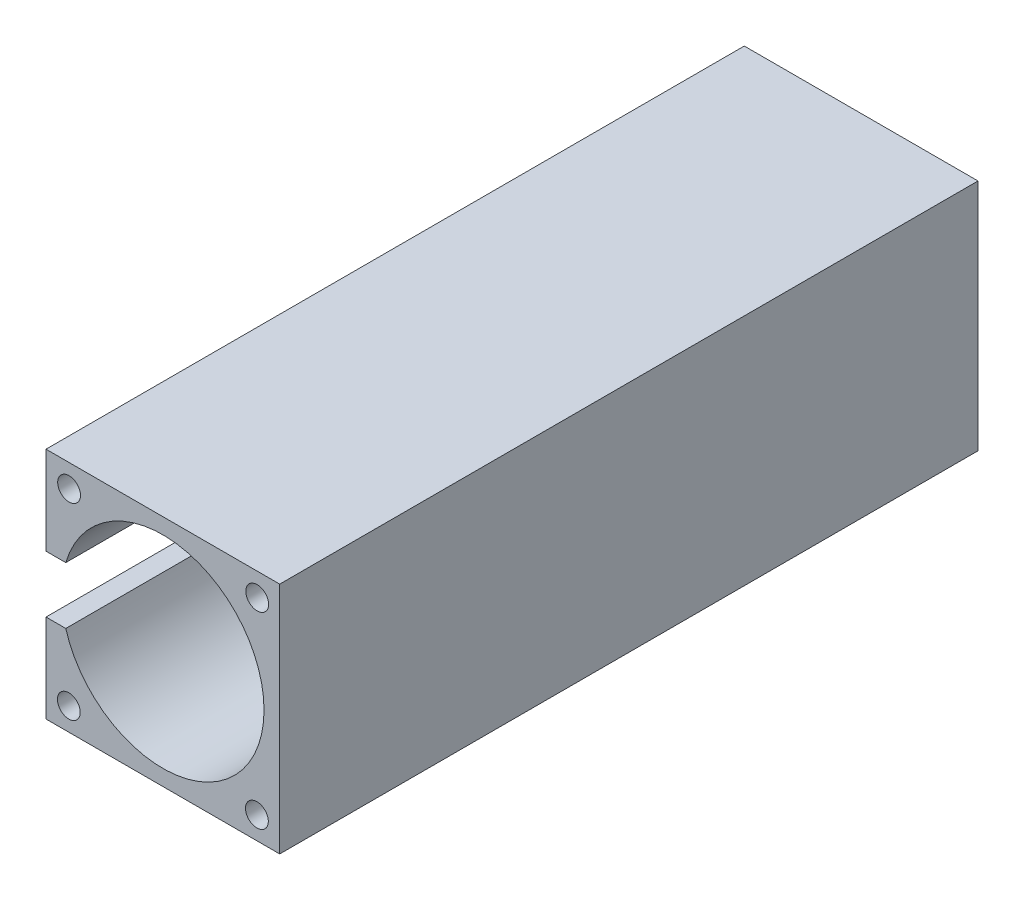
ISO-10303-21;
HEADER;
FILE_DESCRIPTION(('STEP AP214'),'2;1');
FILE_NAME('part.step','',(''),(''),'','','');
FILE_SCHEMA(('AUTOMOTIVE_DESIGN { 1 0 10303 214 1 1 1 1 }'));
ENDSEC;
DATA;
#1=APPLICATION_CONTEXT('core data for automotive mechanical design processes');
#2=APPLICATION_PROTOCOL_DEFINITION('international standard','automotive_design',2000,#1);
#3=PRODUCT_CONTEXT('',#1,'mechanical');
#4=PRODUCT('Part','Part','',(#3));
#5=PRODUCT_RELATED_PRODUCT_CATEGORY('part','',(#4));
#6=PRODUCT_DEFINITION_FORMATION('','',#4);
#7=PRODUCT_DEFINITION_CONTEXT('part definition',#1,'design');
#8=PRODUCT_DEFINITION('design','',#6,#7);
#9=PRODUCT_DEFINITION_SHAPE('','',#8);
#10=(LENGTH_UNIT() NAMED_UNIT(*) SI_UNIT(.MILLI.,.METRE.));
#11=(NAMED_UNIT(*) PLANE_ANGLE_UNIT() SI_UNIT($,.RADIAN.));
#12=(NAMED_UNIT(*) SI_UNIT($,.STERADIAN.) SOLID_ANGLE_UNIT());
#13=UNCERTAINTY_MEASURE_WITH_UNIT(LENGTH_MEASURE(1.E-05),#10,'distance_accuracy_value','');
#14=(GEOMETRIC_REPRESENTATION_CONTEXT(3) GLOBAL_UNCERTAINTY_ASSIGNED_CONTEXT((#13)) GLOBAL_UNIT_ASSIGNED_CONTEXT((#10,
#11,#12)) REPRESENTATION_CONTEXT('',''));
#15=CARTESIAN_POINT('',(0.,0.,0.));
#16=DIRECTION('',(0.,0.,1.));
#17=DIRECTION('',(1.,0.,0.));
#18=AXIS2_PLACEMENT_3D('',#15,#16,#17);
#19=CARTESIAN_POINT('',(-41.,-41.,245.));
#20=DIRECTION('',(1.,0.,0.));
#21=DIRECTION('',(0.,0.,-1.));
#22=AXIS2_PLACEMENT_3D('',#19,#20,#21);
#23=PLANE('',#22);
#24=DIRECTION('',(0.,0.,-1.));
#25=VECTOR('',#24,1.);
#26=CARTESIAN_POINT('',(-41.,41.,245.));
#27=LINE('',#26,#25);
#28=CARTESIAN_POINT('',(-41.,41.,245.));
#29=VERTEX_POINT('',#28);
#30=CARTESIAN_POINT('',(-41.,41.,0.));
#31=VERTEX_POINT('',#30);
#32=EDGE_CURVE('E125',#29,#31,#27,.T.);
#33=ORIENTED_EDGE('',*,*,#32,.T.);
#34=DIRECTION('',(0.,-1.,0.));
#35=VECTOR('',#34,1.);
#36=CARTESIAN_POINT('',(-41.,-41.,0.));
#37=LINE('',#36,#35);
#38=CARTESIAN_POINT('',(-41.,10.,0.));
#39=VERTEX_POINT('',#38);
#40=EDGE_CURVE('E109',#31,#39,#37,.T.);
#41=ORIENTED_EDGE('',*,*,#40,.T.);
#42=DIRECTION('',(0.,0.,1.));
#43=VECTOR('',#42,1.);
#44=CARTESIAN_POINT('',(-41.,10.,-21.540659228538));
#45=LINE('',#44,#43);
#46=CARTESIAN_POINT('',(-41.,10.,245.));
#47=VERTEX_POINT('',#46);
#48=EDGE_CURVE('E302',#39,#47,#45,.T.);
#49=ORIENTED_EDGE('',*,*,#48,.T.);
#50=DIRECTION('',(0.,-1.,0.));
#51=VECTOR('',#50,1.);
#52=CARTESIAN_POINT('',(-41.,-41.,245.));
#53=LINE('',#52,#51);
#54=EDGE_CURVE('E315',#29,#47,#53,.T.);
#55=ORIENTED_EDGE('',*,*,#54,.F.);
#56=EDGE_LOOP('',(#33,#41,#49,#55));
#57=FACE_BOUND('',#56,.T.);
#58=ADVANCED_FACE('F38',(#57),#23,.F.);
#59=DIRECTION('',(0.,0.,1.));
#60=VECTOR('',#59,1.);
#61=CARTESIAN_POINT('',(-41.,-10.,-21.540659228538));
#62=LINE('',#61,#60);
#63=CARTESIAN_POINT('',(-41.,-10.,0.));
#64=VERTEX_POINT('',#63);
#65=CARTESIAN_POINT('',(-41.,-10.,245.));
#66=VERTEX_POINT('',#65);
#67=EDGE_CURVE('E261',#64,#66,#62,.T.);
#68=ORIENTED_EDGE('',*,*,#67,.F.);
#69=CARTESIAN_POINT('',(-41.,-41.,0.));
#70=VERTEX_POINT('',#69);
#71=EDGE_CURVE('E260',#64,#70,#37,.T.);
#72=ORIENTED_EDGE('',*,*,#71,.T.);
#73=DIRECTION('',(0.,0.,-1.));
#74=VECTOR('',#73,1.);
#75=CARTESIAN_POINT('',(-41.,-41.,245.));
#76=LINE('',#75,#74);
#77=CARTESIAN_POINT('',(-41.,-41.,245.));
#78=VERTEX_POINT('',#77);
#79=EDGE_CURVE('E127',#78,#70,#76,.T.);
#80=ORIENTED_EDGE('',*,*,#79,.F.);
#81=EDGE_CURVE('E259',#66,#78,#53,.T.);
#82=ORIENTED_EDGE('',*,*,#81,.F.);
#83=EDGE_LOOP('',(#68,#72,#80,#82));
#84=FACE_BOUND('',#83,.T.);
#85=ADVANCED_FACE('F171',(#84),#23,.F.);
#86=CARTESIAN_POINT('',(-41.,-41.,245.));
#87=DIRECTION('',(0.,1.,0.));
#88=DIRECTION('',(0.,0.,1.));
#89=AXIS2_PLACEMENT_3D('',#86,#87,#88);
#90=PLANE('',#89);
#91=ORIENTED_EDGE('',*,*,#79,.T.);
#92=DIRECTION('',(-1.,0.,0.));
#93=VECTOR('',#92,1.);
#94=CARTESIAN_POINT('',(41.,-41.,0.));
#95=LINE('',#94,#93);
#96=CARTESIAN_POINT('',(41.,-41.,0.));
#97=VERTEX_POINT('',#96);
#98=EDGE_CURVE('E113',#97,#70,#95,.T.);
#99=ORIENTED_EDGE('',*,*,#98,.F.);
#100=DIRECTION('',(0.,0.,-1.));
#101=VECTOR('',#100,1.);
#102=CARTESIAN_POINT('',(41.,-41.,245.));
#103=LINE('',#102,#101);
#104=CARTESIAN_POINT('',(41.,-41.,245.));
#105=VERTEX_POINT('',#104);
#106=EDGE_CURVE('E122',#105,#97,#103,.T.);
#107=ORIENTED_EDGE('',*,*,#106,.F.);
#108=DIRECTION('',(1.,0.,0.));
#109=VECTOR('',#108,1.);
#110=CARTESIAN_POINT('',(-41.,-41.,245.));
#111=LINE('',#110,#109);
#112=EDGE_CURVE('E255',#78,#105,#111,.T.);
#113=ORIENTED_EDGE('',*,*,#112,.F.);
#114=EDGE_LOOP('',(#91,#99,#107,#113));
#115=FACE_BOUND('',#114,.T.);
#116=ADVANCED_FACE('F177',(#115),#90,.F.);
#117=CARTESIAN_POINT('',(41.,-41.,245.));
#118=DIRECTION('',(-1.,0.,0.));
#119=DIRECTION('',(0.,0.,1.));
#120=AXIS2_PLACEMENT_3D('',#117,#118,#119);
#121=PLANE('',#120);
#122=ORIENTED_EDGE('',*,*,#106,.T.);
#123=DIRECTION('',(0.,1.,0.));
#124=VECTOR('',#123,1.);
#125=CARTESIAN_POINT('',(41.,-41.,0.));
#126=LINE('',#125,#124);
#127=CARTESIAN_POINT('',(41.,41.,0.));
#128=VERTEX_POINT('',#127);
#129=EDGE_CURVE('E106',#97,#128,#126,.T.);
#130=ORIENTED_EDGE('',*,*,#129,.T.);
#131=DIRECTION('',(0.,0.,-1.));
#132=VECTOR('',#131,1.);
#133=CARTESIAN_POINT('',(41.,41.,245.));
#134=LINE('',#133,#132);
#135=CARTESIAN_POINT('',(41.,41.,245.));
#136=VERTEX_POINT('',#135);
#137=EDGE_CURVE('E120',#136,#128,#134,.T.);
#138=ORIENTED_EDGE('',*,*,#137,.F.);
#139=DIRECTION('',(0.,1.,0.));
#140=VECTOR('',#139,1.);
#141=CARTESIAN_POINT('',(41.,-41.,245.));
#142=LINE('',#141,#140);
#143=EDGE_CURVE('E318',#105,#136,#142,.T.);
#144=ORIENTED_EDGE('',*,*,#143,.F.);
#145=EDGE_LOOP('',(#122,#130,#138,#144));
#146=FACE_BOUND('',#145,.T.);
#147=ADVANCED_FACE('F118',(#146),#121,.F.);
#148=CARTESIAN_POINT('',(0.,0.,245.));
#149=DIRECTION('',(0.,0.,-1.));
#150=DIRECTION('',(-1.,0.,0.));
#151=AXIS2_PLACEMENT_3D('',#148,#149,#150);
#152=PLANE('',#151);
#153=CARTESIAN_POINT('',(-32.9999999999981,-33.,245.));
#154=DIRECTION('',(0.,0.,1.));
#155=DIRECTION('',(1.,0.,0.));
#156=AXIS2_PLACEMENT_3D('',#153,#154,#155);
#157=CIRCLE('',#156,4.000000000001);
#158=CARTESIAN_POINT('',(-28.9999999999971,-33.,245.));
#159=VERTEX_POINT('',#158);
#160=EDGE_CURVE('E274',#159,#159,#157,.T.);
#161=ORIENTED_EDGE('',*,*,#160,.F.);
#162=EDGE_LOOP('',(#161));
#163=FACE_BOUND('',#162,.T.);
#164=CARTESIAN_POINT('',(33.0000000000019,-33.0999999999982,245.));
#165=DIRECTION('',(0.,0.,1.));
#166=DIRECTION('',(1.,0.,0.));
#167=AXIS2_PLACEMENT_3D('',#164,#165,#166);
#168=CIRCLE('',#167,4.00000000000001);
#169=CARTESIAN_POINT('',(37.0000000000019,-33.0999999999982,245.));
#170=VERTEX_POINT('',#169);
#171=EDGE_CURVE('E287',#170,#170,#168,.T.);
#172=ORIENTED_EDGE('',*,*,#171,.F.);
#173=EDGE_LOOP('',(#172));
#174=FACE_BOUND('',#173,.T.);
#175=CARTESIAN_POINT('',(33.1000000000001,32.9000000000018,245.));
#176=DIRECTION('',(0.,0.,1.));
#177=DIRECTION('',(1.,0.,0.));
#178=AXIS2_PLACEMENT_3D('',#175,#176,#177);
#179=CIRCLE('',#178,4.);
#180=CARTESIAN_POINT('',(37.1000000000001,32.9000000000018,245.));
#181=VERTEX_POINT('',#180);
#182=EDGE_CURVE('E283',#181,#181,#179,.T.);
#183=ORIENTED_EDGE('',*,*,#182,.F.);
#184=EDGE_LOOP('',(#183));
#185=FACE_BOUND('',#184,.T.);
#186=CARTESIAN_POINT('',(-32.9,33.,245.));
#187=DIRECTION('',(0.,0.,1.));
#188=DIRECTION('',(1.,0.,0.));
#189=AXIS2_PLACEMENT_3D('',#186,#187,#188);
#190=CIRCLE('',#189,4.);
#191=CARTESIAN_POINT('',(-28.9,33.,245.));
#192=VERTEX_POINT('',#191);
#193=EDGE_CURVE('E286',#192,#192,#190,.T.);
#194=ORIENTED_EDGE('',*,*,#193,.F.);
#195=EDGE_LOOP('',(#194));
#196=FACE_BOUND('',#195,.T.);
#197=CARTESIAN_POINT('',(0.,0.,245.));
#198=DIRECTION('',(0.,0.,1.));
#199=DIRECTION('',(1.,0.,0.));
#200=AXIS2_PLACEMENT_3D('',#197,#198,#199);
#201=CIRCLE('',#200,35.5);
#202=CARTESIAN_POINT('',(-34.0624426605022,-10.,245.));
#203=VERTEX_POINT('',#202);
#204=CARTESIAN_POINT('',(-34.0624426605022,10.,245.));
#205=VERTEX_POINT('',#204);
#206=EDGE_CURVE('E311',#203,#205,#201,.T.);
#207=ORIENTED_EDGE('',*,*,#206,.F.);
#208=DIRECTION('',(1.,0.,0.));
#209=VECTOR('',#208,1.);
#210=CARTESIAN_POINT('',(-41.,-10.,245.));
#211=LINE('',#210,#209);
#212=EDGE_CURVE('E294',#66,#203,#211,.T.);
#213=ORIENTED_EDGE('',*,*,#212,.F.);
#214=ORIENTED_EDGE('',*,*,#81,.T.);
#215=ORIENTED_EDGE('',*,*,#112,.T.);
#216=ORIENTED_EDGE('',*,*,#143,.T.);
#217=DIRECTION('',(-1.,0.,0.));
#218=VECTOR('',#217,1.);
#219=CARTESIAN_POINT('',(-41.,41.,245.));
#220=LINE('',#219,#218);
#221=EDGE_CURVE('E62',#136,#29,#220,.T.);
#222=ORIENTED_EDGE('',*,*,#221,.T.);
#223=ORIENTED_EDGE('',*,*,#54,.T.);
#224=DIRECTION('',(-1.,0.,0.));
#225=VECTOR('',#224,1.);
#226=CARTESIAN_POINT('',(-41.,10.,245.));
#227=LINE('',#226,#225);
#228=EDGE_CURVE('E295',#205,#47,#227,.T.);
#229=ORIENTED_EDGE('',*,*,#228,.F.);
#230=EDGE_LOOP('',(#207,#213,#214,#215,#216,#222,#223,#229));
#231=FACE_BOUND('',#230,.T.);
#232=ADVANCED_FACE('F241',(#163,#174,#185,#196,#231),#152,.F.);
#233=CARTESIAN_POINT('',(-41.,41.,245.));
#234=DIRECTION('',(0.,-1.,0.));
#235=DIRECTION('',(0.,0.,-1.));
#236=AXIS2_PLACEMENT_3D('',#233,#234,#235);
#237=PLANE('',#236);
#238=ORIENTED_EDGE('',*,*,#137,.T.);
#239=DIRECTION('',(-1.,0.,0.));
#240=VECTOR('',#239,1.);
#241=CARTESIAN_POINT('',(41.,41.,0.));
#242=LINE('',#241,#240);
#243=EDGE_CURVE('E103',#128,#31,#242,.T.);
#244=ORIENTED_EDGE('',*,*,#243,.T.);
#245=ORIENTED_EDGE('',*,*,#32,.F.);
#246=ORIENTED_EDGE('',*,*,#221,.F.);
#247=EDGE_LOOP('',(#238,#244,#245,#246));
#248=FACE_BOUND('',#247,.T.);
#249=ADVANCED_FACE('F124',(#248),#237,.F.);
#250=CARTESIAN_POINT('',(0.,0.,245.));
#251=DIRECTION('',(0.,0.,-1.));
#252=DIRECTION('',(-1.,0.,0.));
#253=AXIS2_PLACEMENT_3D('',#250,#251,#252);
#254=CYLINDRICAL_SURFACE('',#253,35.5);
#255=DIRECTION('',(0.,0.,-1.));
#256=VECTOR('',#255,1.);
#257=CARTESIAN_POINT('',(-34.0624426605022,-10.,245.));
#258=LINE('',#257,#256);
#259=CARTESIAN_POINT('',(-34.0624426605022,-10.,0.));
#260=VERTEX_POINT('',#259);
#261=EDGE_CURVE('E308',#203,#260,#258,.T.);
#262=ORIENTED_EDGE('',*,*,#261,.F.);
#263=ORIENTED_EDGE('',*,*,#206,.T.);
#264=DIRECTION('',(0.,0.,-1.));
#265=VECTOR('',#264,1.);
#266=CARTESIAN_POINT('',(-34.0624426605022,10.,245.));
#267=LINE('',#266,#265);
#268=CARTESIAN_POINT('',(-34.0624426605022,10.,0.));
#269=VERTEX_POINT('',#268);
#270=EDGE_CURVE('E306',#269,#205,#267,.F.);
#271=ORIENTED_EDGE('',*,*,#270,.F.);
#272=CARTESIAN_POINT('',(0.,0.,0.));
#273=DIRECTION('',(0.,0.,1.));
#274=DIRECTION('',(1.,0.,0.));
#275=AXIS2_PLACEMENT_3D('',#272,#273,#274);
#276=CIRCLE('',#275,35.5);
#277=EDGE_CURVE('E54',#260,#269,#276,.T.);
#278=ORIENTED_EDGE('',*,*,#277,.F.);
#279=EDGE_LOOP('',(#262,#263,#271,#278));
#280=FACE_BOUND('',#279,.T.);
#281=ADVANCED_FACE('F236',(#280),#254,.F.);
#282=CARTESIAN_POINT('',(-41.,-10.,-21.540659228538));
#283=DIRECTION('',(0.,-1.,0.));
#284=DIRECTION('',(0.,0.,-1.));
#285=AXIS2_PLACEMENT_3D('',#282,#283,#284);
#286=PLANE('',#285);
#287=ORIENTED_EDGE('',*,*,#261,.T.);
#288=DIRECTION('',(1.,0.,0.));
#289=VECTOR('',#288,1.);
#290=CARTESIAN_POINT('',(-41.,-10.,0.));
#291=LINE('',#290,#289);
#292=EDGE_CURVE('E297',#64,#260,#291,.T.);
#293=ORIENTED_EDGE('',*,*,#292,.F.);
#294=ORIENTED_EDGE('',*,*,#67,.T.);
#295=ORIENTED_EDGE('',*,*,#212,.T.);
#296=EDGE_LOOP('',(#287,#293,#294,#295));
#297=FACE_BOUND('',#296,.T.);
#298=ADVANCED_FACE('F232',(#297),#286,.F.);
#299=CARTESIAN_POINT('',(-41.,10.,-21.540659228538));
#300=DIRECTION('',(0.,1.,0.));
#301=DIRECTION('',(0.,0.,1.));
#302=AXIS2_PLACEMENT_3D('',#299,#300,#301);
#303=PLANE('',#302);
#304=ORIENTED_EDGE('',*,*,#270,.T.);
#305=ORIENTED_EDGE('',*,*,#228,.T.);
#306=ORIENTED_EDGE('',*,*,#48,.F.);
#307=DIRECTION('',(-1.,0.,0.));
#308=VECTOR('',#307,1.);
#309=CARTESIAN_POINT('',(-41.,10.,0.));
#310=LINE('',#309,#308);
#311=EDGE_CURVE('E300',#269,#39,#310,.T.);
#312=ORIENTED_EDGE('',*,*,#311,.F.);
#313=EDGE_LOOP('',(#304,#305,#306,#312));
#314=FACE_BOUND('',#313,.T.);
#315=ADVANCED_FACE('F228',(#314),#303,.F.);
#316=CARTESIAN_POINT('',(-32.9,33.,225.));
#317=DIRECTION('',(0.,0.,1.));
#318=DIRECTION('',(1.,0.,0.));
#319=AXIS2_PLACEMENT_3D('',#316,#317,#318);
#320=CYLINDRICAL_SURFACE('',#319,4.);
#321=CARTESIAN_POINT('',(-32.9,33.,228.));
#322=DIRECTION('',(0.,0.,1.));
#323=DIRECTION('',(1.,0.,0.));
#324=AXIS2_PLACEMENT_3D('',#321,#322,#323);
#325=CIRCLE('',#324,4.);
#326=CARTESIAN_POINT('',(-28.9,33.,228.));
#327=VERTEX_POINT('',#326);
#328=EDGE_CURVE('E137',#327,#327,#325,.F.);
#329=ORIENTED_EDGE('',*,*,#328,.T.);
#330=EDGE_LOOP('',(#329));
#331=FACE_BOUND('',#330,.T.);
#332=ORIENTED_EDGE('',*,*,#193,.T.);
#333=EDGE_LOOP('',(#332));
#334=FACE_BOUND('',#333,.T.);
#335=ADVANCED_FACE('F224',(#331,#334),#320,.F.);
#336=CARTESIAN_POINT('',(-32.9,33.,225.));
#337=DIRECTION('',(0.,0.,1.));
#338=DIRECTION('',(1.,0.,0.));
#339=AXIS2_PLACEMENT_3D('',#336,#337,#338);
#340=PLANE('',#339);
#341=CARTESIAN_POINT('',(-32.9,33.,225.));
#342=DIRECTION('',(0.,0.,1.));
#343=DIRECTION('',(1.,0.,0.));
#344=AXIS2_PLACEMENT_3D('',#341,#342,#343);
#345=CIRCLE('',#344,1.);
#346=CARTESIAN_POINT('',(-31.9,33.,225.));
#347=VERTEX_POINT('',#346);
#348=EDGE_CURVE('E134',#347,#347,#345,.T.);
#349=ORIENTED_EDGE('',*,*,#348,.T.);
#350=EDGE_LOOP('',(#349));
#351=FACE_BOUND('',#350,.T.);
#352=ADVANCED_FACE('F206',(#351),#340,.T.);
#353=CARTESIAN_POINT('',(33.1000000000001,32.9000000000018,225.));
#354=DIRECTION('',(0.,0.,1.));
#355=DIRECTION('',(1.,0.,0.));
#356=AXIS2_PLACEMENT_3D('',#353,#354,#355);
#357=CYLINDRICAL_SURFACE('',#356,4.);
#358=CARTESIAN_POINT('',(33.1000000000001,32.9000000000018,228.));
#359=DIRECTION('',(0.,0.,1.));
#360=DIRECTION('',(1.,0.,0.));
#361=AXIS2_PLACEMENT_3D('',#358,#359,#360);
#362=CIRCLE('',#361,4.);
#363=CARTESIAN_POINT('',(37.1000000000001,32.9000000000018,228.));
#364=VERTEX_POINT('',#363);
#365=EDGE_CURVE('E143',#364,#364,#362,.F.);
#366=ORIENTED_EDGE('',*,*,#365,.T.);
#367=EDGE_LOOP('',(#366));
#368=FACE_BOUND('',#367,.T.);
#369=ORIENTED_EDGE('',*,*,#182,.T.);
#370=EDGE_LOOP('',(#369));
#371=FACE_BOUND('',#370,.T.);
#372=ADVANCED_FACE('F198',(#368,#371),#357,.F.);
#373=CARTESIAN_POINT('',(33.1000000000001,32.9000000000018,225.));
#374=DIRECTION('',(0.,0.,1.));
#375=DIRECTION('',(1.,0.,0.));
#376=AXIS2_PLACEMENT_3D('',#373,#374,#375);
#377=PLANE('',#376);
#378=CARTESIAN_POINT('',(33.1000000000001,32.9000000000018,225.));
#379=DIRECTION('',(0.,0.,1.));
#380=DIRECTION('',(1.,0.,0.));
#381=AXIS2_PLACEMENT_3D('',#378,#379,#380);
#382=CIRCLE('',#381,0.999999999999997);
#383=CARTESIAN_POINT('',(34.1,32.9000000000018,225.));
#384=VERTEX_POINT('',#383);
#385=EDGE_CURVE('E140',#384,#384,#382,.T.);
#386=ORIENTED_EDGE('',*,*,#385,.T.);
#387=EDGE_LOOP('',(#386));
#388=FACE_BOUND('',#387,.T.);
#389=ADVANCED_FACE('F195',(#388),#377,.T.);
#390=CARTESIAN_POINT('',(33.0000000000019,-33.0999999999982,225.));
#391=DIRECTION('',(0.,0.,1.));
#392=DIRECTION('',(1.,0.,0.));
#393=AXIS2_PLACEMENT_3D('',#390,#391,#392);
#394=CYLINDRICAL_SURFACE('',#393,4.00000000000001);
#395=CARTESIAN_POINT('',(33.0000000000019,-33.0999999999982,228.));
#396=DIRECTION('',(0.,0.,1.));
#397=DIRECTION('',(1.,0.,0.));
#398=AXIS2_PLACEMENT_3D('',#395,#396,#397);
#399=CIRCLE('',#398,4.00000000000001);
#400=CARTESIAN_POINT('',(37.0000000000019,-33.0999999999982,228.));
#401=VERTEX_POINT('',#400);
#402=EDGE_CURVE('E11',#401,#401,#399,.F.);
#403=ORIENTED_EDGE('',*,*,#402,.T.);
#404=EDGE_LOOP('',(#403));
#405=FACE_BOUND('',#404,.T.);
#406=ORIENTED_EDGE('',*,*,#171,.T.);
#407=EDGE_LOOP('',(#406));
#408=FACE_BOUND('',#407,.T.);
#409=ADVANCED_FACE('F197',(#405,#408),#394,.F.);
#410=CARTESIAN_POINT('',(33.0000000000019,-33.0999999999982,225.));
#411=DIRECTION('',(0.,0.,1.));
#412=DIRECTION('',(1.,0.,0.));
#413=AXIS2_PLACEMENT_3D('',#410,#411,#412);
#414=PLANE('',#413);
#415=CARTESIAN_POINT('',(33.0000000000019,-33.0999999999982,225.));
#416=DIRECTION('',(0.,0.,1.));
#417=DIRECTION('',(1.,0.,0.));
#418=AXIS2_PLACEMENT_3D('',#415,#416,#417);
#419=CIRCLE('',#418,1.00000000000001);
#420=CARTESIAN_POINT('',(34.0000000000019,-33.0999999999982,225.));
#421=VERTEX_POINT('',#420);
#422=EDGE_CURVE('E47',#421,#421,#419,.T.);
#423=ORIENTED_EDGE('',*,*,#422,.T.);
#424=EDGE_LOOP('',(#423));
#425=FACE_BOUND('',#424,.T.);
#426=ADVANCED_FACE('F155',(#425),#414,.T.);
#427=CARTESIAN_POINT('',(-32.9999999999981,-33.,225.));
#428=DIRECTION('',(0.,0.,1.));
#429=DIRECTION('',(1.,0.,0.));
#430=AXIS2_PLACEMENT_3D('',#427,#428,#429);
#431=CYLINDRICAL_SURFACE('',#430,4.000000000001);
#432=CARTESIAN_POINT('',(-32.9999999999981,-33.,228.));
#433=DIRECTION('',(0.,0.,1.));
#434=DIRECTION('',(1.,0.,0.));
#435=AXIS2_PLACEMENT_3D('',#432,#433,#434);
#436=CIRCLE('',#435,4.000000000001);
#437=CARTESIAN_POINT('',(-28.9999999999971,-33.,228.));
#438=VERTEX_POINT('',#437);
#439=EDGE_CURVE('E149',#438,#438,#436,.F.);
#440=ORIENTED_EDGE('',*,*,#439,.T.);
#441=EDGE_LOOP('',(#440));
#442=FACE_BOUND('',#441,.T.);
#443=ORIENTED_EDGE('',*,*,#160,.T.);
#444=EDGE_LOOP('',(#443));
#445=FACE_BOUND('',#444,.T.);
#446=ADVANCED_FACE('F214',(#442,#445),#431,.F.);
#447=CARTESIAN_POINT('',(-32.9999999999981,-33.,225.));
#448=DIRECTION('',(0.,0.,1.));
#449=DIRECTION('',(1.,0.,0.));
#450=AXIS2_PLACEMENT_3D('',#447,#448,#449);
#451=PLANE('',#450);
#452=CARTESIAN_POINT('',(-32.9999999999981,-33.,225.));
#453=DIRECTION('',(0.,0.,1.));
#454=DIRECTION('',(1.,0.,0.));
#455=AXIS2_PLACEMENT_3D('',#452,#453,#454);
#456=CIRCLE('',#455,1.000000000001);
#457=CARTESIAN_POINT('',(-31.9999999999971,-33.,225.));
#458=VERTEX_POINT('',#457);
#459=EDGE_CURVE('E146',#458,#458,#456,.T.);
#460=ORIENTED_EDGE('',*,*,#459,.T.);
#461=EDGE_LOOP('',(#460));
#462=FACE_BOUND('',#461,.T.);
#463=ADVANCED_FACE('F185',(#462),#451,.T.);
#464=CARTESIAN_POINT('',(-32.9,33.,228.));
#465=DIRECTION('',(0.,0.,1.));
#466=DIRECTION('',(1.,0.,0.));
#467=AXIS2_PLACEMENT_3D('',#464,#465,#466);
#468=DEGENERATE_TOROIDAL_SURFACE('',#467,1.,3.,.T.);
#469=ORIENTED_EDGE('',*,*,#328,.F.);
#470=EDGE_LOOP('',(#469));
#471=FACE_BOUND('',#470,.T.);
#472=ORIENTED_EDGE('',*,*,#348,.F.);
#473=EDGE_LOOP('',(#472));
#474=FACE_BOUND('',#473,.T.);
#475=ADVANCED_FACE('F182',(#471,#474),#468,.F.);
#476=CARTESIAN_POINT('',(33.1000000000001,32.9000000000018,228.));
#477=DIRECTION('',(0.,0.,1.));
#478=DIRECTION('',(1.,0.,0.));
#479=AXIS2_PLACEMENT_3D('',#476,#477,#478);
#480=DEGENERATE_TOROIDAL_SURFACE('',#479,0.999999999999997,3.,.T.);
#481=ORIENTED_EDGE('',*,*,#365,.F.);
#482=EDGE_LOOP('',(#481));
#483=FACE_BOUND('',#482,.T.);
#484=ORIENTED_EDGE('',*,*,#385,.F.);
#485=EDGE_LOOP('',(#484));
#486=FACE_BOUND('',#485,.T.);
#487=ADVANCED_FACE('F167',(#483,#486),#480,.F.);
#488=CARTESIAN_POINT('',(-32.9999999999981,-33.,228.));
#489=DIRECTION('',(0.,0.,1.));
#490=DIRECTION('',(1.,0.,0.));
#491=AXIS2_PLACEMENT_3D('',#488,#489,#490);
#492=DEGENERATE_TOROIDAL_SURFACE('',#491,1.000000000001,3.,.T.);
#493=ORIENTED_EDGE('',*,*,#439,.F.);
#494=EDGE_LOOP('',(#493));
#495=FACE_BOUND('',#494,.T.);
#496=ORIENTED_EDGE('',*,*,#459,.F.);
#497=EDGE_LOOP('',(#496));
#498=FACE_BOUND('',#497,.T.);
#499=ADVANCED_FACE('F158',(#495,#498),#492,.F.);
#500=CARTESIAN_POINT('',(33.0000000000019,-33.0999999999982,228.));
#501=DIRECTION('',(0.,0.,1.));
#502=DIRECTION('',(1.,0.,0.));
#503=AXIS2_PLACEMENT_3D('',#500,#501,#502);
#504=DEGENERATE_TOROIDAL_SURFACE('',#503,1.00000000000001,3.,.T.);
#505=ORIENTED_EDGE('',*,*,#402,.F.);
#506=EDGE_LOOP('',(#505));
#507=FACE_BOUND('',#506,.T.);
#508=ORIENTED_EDGE('',*,*,#422,.F.);
#509=EDGE_LOOP('',(#508));
#510=FACE_BOUND('',#509,.T.);
#511=ADVANCED_FACE('F40',(#507,#510),#504,.F.);
#512=CARTESIAN_POINT('',(41.,-41.,0.));
#513=DIRECTION('',(0.,0.,1.));
#514=DIRECTION('',(1.,0.,0.));
#515=AXIS2_PLACEMENT_3D('',#512,#513,#514);
#516=PLANE('',#515);
#517=CARTESIAN_POINT('',(-33.,-33.,0.));
#518=DIRECTION('',(0.,0.,1.));
#519=DIRECTION('',(1.,0.,0.));
#520=AXIS2_PLACEMENT_3D('',#517,#518,#519);
#521=CIRCLE('',#520,1.2);
#522=CARTESIAN_POINT('',(-31.8,-33.,0.));
#523=VERTEX_POINT('',#522);
#524=EDGE_CURVE('E267',#523,#523,#521,.F.);
#525=ORIENTED_EDGE('',*,*,#524,.F.);
#526=EDGE_LOOP('',(#525));
#527=FACE_BOUND('',#526,.T.);
#528=CARTESIAN_POINT('',(33.,33.,0.));
#529=DIRECTION('',(0.,0.,1.));
#530=DIRECTION('',(1.,0.,0.));
#531=AXIS2_PLACEMENT_3D('',#528,#529,#530);
#532=CIRCLE('',#531,1.2);
#533=CARTESIAN_POINT('',(34.2,33.,0.));
#534=VERTEX_POINT('',#533);
#535=EDGE_CURVE('E42',#534,#534,#532,.F.);
#536=ORIENTED_EDGE('',*,*,#535,.F.);
#537=EDGE_LOOP('',(#536));
#538=FACE_BOUND('',#537,.T.);
#539=CARTESIAN_POINT('',(33.,-33.,0.));
#540=DIRECTION('',(0.,0.,1.));
#541=DIRECTION('',(1.,0.,0.));
#542=AXIS2_PLACEMENT_3D('',#539,#540,#541);
#543=CIRCLE('',#542,1.2);
#544=CARTESIAN_POINT('',(34.2,-33.,0.));
#545=VERTEX_POINT('',#544);
#546=EDGE_CURVE('E380',#545,#545,#543,.F.);
#547=ORIENTED_EDGE('',*,*,#546,.F.);
#548=EDGE_LOOP('',(#547));
#549=FACE_BOUND('',#548,.T.);
#550=CARTESIAN_POINT('',(-36.,20.,0.));
#551=DIRECTION('',(0.,0.,1.));
#552=DIRECTION('',(1.,0.,0.));
#553=AXIS2_PLACEMENT_3D('',#550,#551,#552);
#554=CIRCLE('',#553,1.2);
#555=CARTESIAN_POINT('',(-34.8,20.,0.));
#556=VERTEX_POINT('',#555);
#557=EDGE_CURVE('E263',#556,#556,#554,.F.);
#558=ORIENTED_EDGE('',*,*,#557,.F.);
#559=EDGE_LOOP('',(#558));
#560=FACE_BOUND('',#559,.T.);
#561=ORIENTED_EDGE('',*,*,#243,.F.);
#562=ORIENTED_EDGE('',*,*,#129,.F.);
#563=ORIENTED_EDGE('',*,*,#98,.T.);
#564=ORIENTED_EDGE('',*,*,#71,.F.);
#565=ORIENTED_EDGE('',*,*,#292,.T.);
#566=ORIENTED_EDGE('',*,*,#277,.T.);
#567=ORIENTED_EDGE('',*,*,#311,.T.);
#568=ORIENTED_EDGE('',*,*,#40,.F.);
#569=EDGE_LOOP('',(#561,#562,#563,#564,#565,#566,#567,#568));
#570=FACE_BOUND('',#569,.T.);
#571=ADVANCED_FACE('F105',(#527,#538,#549,#560,#570),#516,.F.);
#572=CARTESIAN_POINT('',(33.,-33.,5.));
#573=DIRECTION('',(0.,0.,-1.));
#574=DIRECTION('',(-1.,0.,0.));
#575=AXIS2_PLACEMENT_3D('',#572,#573,#574);
#576=PLANE('',#575);
#577=CARTESIAN_POINT('',(33.,-33.,5.));
#578=DIRECTION('',(0.,0.,-1.));
#579=DIRECTION('',(-1.,0.,0.));
#580=AXIS2_PLACEMENT_3D('',#577,#578,#579);
#581=CIRCLE('',#580,1.2);
#582=CARTESIAN_POINT('',(31.8,-33.,5.));
#583=VERTEX_POINT('',#582);
#584=EDGE_CURVE('E275',#583,#583,#581,.T.);
#585=ORIENTED_EDGE('',*,*,#584,.T.);
#586=EDGE_LOOP('',(#585));
#587=FACE_BOUND('',#586,.T.);
#588=ADVANCED_FACE('F164',(#587),#576,.T.);
#589=CARTESIAN_POINT('',(33.,-33.,5.));
#590=DIRECTION('',(0.,0.,-1.));
#591=DIRECTION('',(-1.,0.,0.));
#592=AXIS2_PLACEMENT_3D('',#589,#590,#591);
#593=CYLINDRICAL_SURFACE('',#592,1.2);
#594=ORIENTED_EDGE('',*,*,#546,.T.);
#595=EDGE_LOOP('',(#594));
#596=FACE_BOUND('',#595,.T.);
#597=ORIENTED_EDGE('',*,*,#584,.F.);
#598=EDGE_LOOP('',(#597));
#599=FACE_BOUND('',#598,.T.);
#600=ADVANCED_FACE('F363',(#596,#599),#593,.F.);
#601=CARTESIAN_POINT('',(-33.,-33.,5.));
#602=DIRECTION('',(0.,0.,-1.));
#603=DIRECTION('',(-1.,0.,0.));
#604=AXIS2_PLACEMENT_3D('',#601,#602,#603);
#605=PLANE('',#604);
#606=CARTESIAN_POINT('',(-33.,-33.,5.));
#607=DIRECTION('',(0.,0.,-1.));
#608=DIRECTION('',(-1.,0.,0.));
#609=AXIS2_PLACEMENT_3D('',#606,#607,#608);
#610=CIRCLE('',#609,1.2);
#611=CARTESIAN_POINT('',(-34.2,-33.,5.));
#612=VERTEX_POINT('',#611);
#613=EDGE_CURVE('E278',#612,#612,#610,.T.);
#614=ORIENTED_EDGE('',*,*,#613,.T.);
#615=EDGE_LOOP('',(#614));
#616=FACE_BOUND('',#615,.T.);
#617=ADVANCED_FACE('F357',(#616),#605,.T.);
#618=CARTESIAN_POINT('',(-33.,-33.,5.));
#619=DIRECTION('',(0.,0.,-1.));
#620=DIRECTION('',(-1.,0.,0.));
#621=AXIS2_PLACEMENT_3D('',#618,#619,#620);
#622=CYLINDRICAL_SURFACE('',#621,1.2);
#623=ORIENTED_EDGE('',*,*,#524,.T.);
#624=EDGE_LOOP('',(#623));
#625=FACE_BOUND('',#624,.T.);
#626=ORIENTED_EDGE('',*,*,#613,.F.);
#627=EDGE_LOOP('',(#626));
#628=FACE_BOUND('',#627,.T.);
#629=ADVANCED_FACE('F351',(#625,#628),#622,.F.);
#630=CARTESIAN_POINT('',(-36.,20.,5.));
#631=DIRECTION('',(0.,0.,-1.));
#632=DIRECTION('',(-1.,0.,0.));
#633=AXIS2_PLACEMENT_3D('',#630,#631,#632);
#634=PLANE('',#633);
#635=CARTESIAN_POINT('',(-36.,20.,5.));
#636=DIRECTION('',(0.,0.,-1.));
#637=DIRECTION('',(-1.,0.,0.));
#638=AXIS2_PLACEMENT_3D('',#635,#636,#637);
#639=CIRCLE('',#638,1.2);
#640=CARTESIAN_POINT('',(-37.2,20.,5.));
#641=VERTEX_POINT('',#640);
#642=EDGE_CURVE('E265',#641,#641,#639,.T.);
#643=ORIENTED_EDGE('',*,*,#642,.T.);
#644=EDGE_LOOP('',(#643));
#645=FACE_BOUND('',#644,.T.);
#646=ADVANCED_FACE('F339',(#645),#634,.T.);
#647=CARTESIAN_POINT('',(-36.,20.,5.));
#648=DIRECTION('',(0.,0.,-1.));
#649=DIRECTION('',(-1.,0.,0.));
#650=AXIS2_PLACEMENT_3D('',#647,#648,#649);
#651=CYLINDRICAL_SURFACE('',#650,1.2);
#652=ORIENTED_EDGE('',*,*,#557,.T.);
#653=EDGE_LOOP('',(#652));
#654=FACE_BOUND('',#653,.T.);
#655=ORIENTED_EDGE('',*,*,#642,.F.);
#656=EDGE_LOOP('',(#655));
#657=FACE_BOUND('',#656,.T.);
#658=ADVANCED_FACE('F210',(#654,#657),#651,.F.);
#659=CARTESIAN_POINT('',(33.,33.,5.));
#660=DIRECTION('',(0.,0.,-1.));
#661=DIRECTION('',(-1.,0.,0.));
#662=AXIS2_PLACEMENT_3D('',#659,#660,#661);
#663=PLANE('',#662);
#664=CARTESIAN_POINT('',(33.,33.,5.));
#665=DIRECTION('',(0.,0.,-1.));
#666=DIRECTION('',(-1.,0.,0.));
#667=AXIS2_PLACEMENT_3D('',#664,#665,#666);
#668=CIRCLE('',#667,1.2);
#669=CARTESIAN_POINT('',(31.8,33.,5.));
#670=VERTEX_POINT('',#669);
#671=EDGE_CURVE('E271',#670,#670,#668,.T.);
#672=ORIENTED_EDGE('',*,*,#671,.T.);
#673=EDGE_LOOP('',(#672));
#674=FACE_BOUND('',#673,.T.);
#675=ADVANCED_FACE('F342',(#674),#663,.T.);
#676=CARTESIAN_POINT('',(33.,33.,5.));
#677=DIRECTION('',(0.,0.,-1.));
#678=DIRECTION('',(-1.,0.,0.));
#679=AXIS2_PLACEMENT_3D('',#676,#677,#678);
#680=CYLINDRICAL_SURFACE('',#679,1.2);
#681=ORIENTED_EDGE('',*,*,#535,.T.);
#682=EDGE_LOOP('',(#681));
#683=FACE_BOUND('',#682,.T.);
#684=ORIENTED_EDGE('',*,*,#671,.F.);
#685=EDGE_LOOP('',(#684));
#686=FACE_BOUND('',#685,.T.);
#687=ADVANCED_FACE('F348',(#683,#686),#680,.F.);
#688=CLOSED_SHELL('',(#58,#85,#116,#147,#232,#249,#281,#298,#315,#335,#352,#372,#389,#409,#426,
#446,#463,#475,#487,#499,#511,#571,#588,#600,#617,#629,#646,#658,#675,#687));
#689=MANIFOLD_SOLID_BREP('B2',#688);
#690=ADVANCED_BREP_SHAPE_REPRESENTATION('',(#18,#689),#14);
#691=SHAPE_DEFINITION_REPRESENTATION(#9,#690);
ENDSEC;
END-ISO-10303-21;
